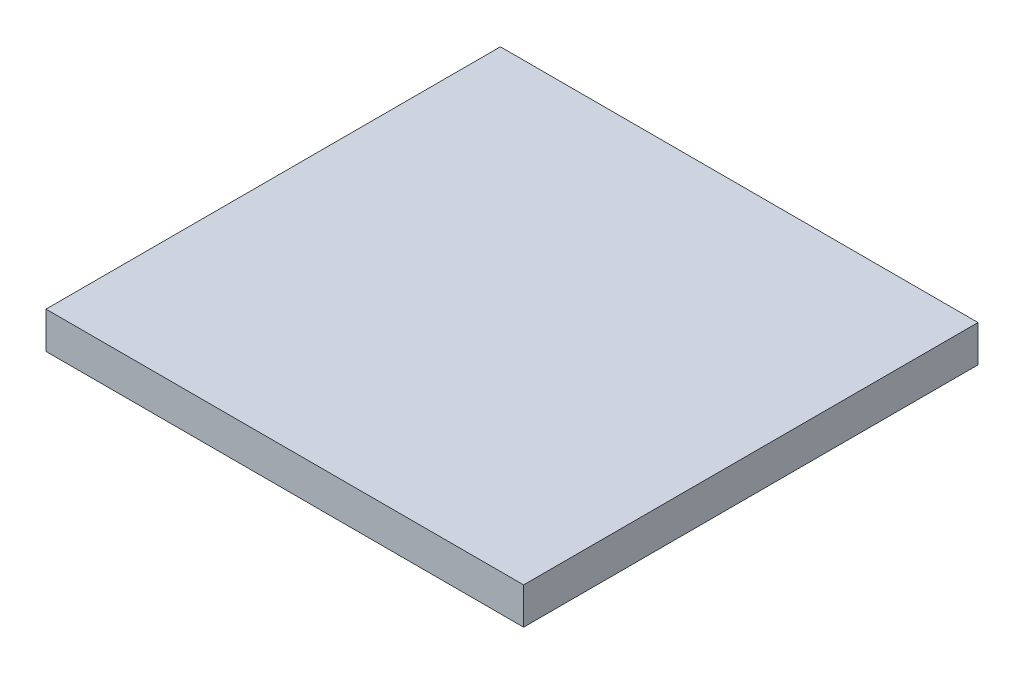
ISO-10303-21;
HEADER;
FILE_DESCRIPTION(('STEP AP214'),'2;1');
FILE_NAME('part.step','',(''),(''),'','','');
FILE_SCHEMA(('AUTOMOTIVE_DESIGN { 1 0 10303 214 1 1 1 1 }'));
ENDSEC;
DATA;
#1=APPLICATION_CONTEXT('core data for automotive mechanical design processes');
#2=APPLICATION_PROTOCOL_DEFINITION('international standard','automotive_design',2000,#1);
#3=PRODUCT_CONTEXT('',#1,'mechanical');
#4=PRODUCT('Part','Part','',(#3));
#5=PRODUCT_RELATED_PRODUCT_CATEGORY('part','',(#4));
#6=PRODUCT_DEFINITION_FORMATION('','',#4);
#7=PRODUCT_DEFINITION_CONTEXT('part definition',#1,'design');
#8=PRODUCT_DEFINITION('design','',#6,#7);
#9=PRODUCT_DEFINITION_SHAPE('','',#8);
#10=(LENGTH_UNIT() NAMED_UNIT(*) SI_UNIT(.MILLI.,.METRE.));
#11=(NAMED_UNIT(*) PLANE_ANGLE_UNIT() SI_UNIT($,.RADIAN.));
#12=(NAMED_UNIT(*) SI_UNIT($,.STERADIAN.) SOLID_ANGLE_UNIT());
#13=UNCERTAINTY_MEASURE_WITH_UNIT(LENGTH_MEASURE(1.E-05),#10,'distance_accuracy_value','');
#14=(GEOMETRIC_REPRESENTATION_CONTEXT(3) GLOBAL_UNCERTAINTY_ASSIGNED_CONTEXT((#13)) GLOBAL_UNIT_ASSIGNED_CONTEXT((#10,
#11,#12)) REPRESENTATION_CONTEXT('',''));
#15=CARTESIAN_POINT('',(0.,0.,0.));
#16=DIRECTION('',(0.,0.,1.));
#17=DIRECTION('',(1.,0.,0.));
#18=AXIS2_PLACEMENT_3D('',#15,#16,#17);
#19=CARTESIAN_POINT('',(19.535,3.,-18.585));
#20=DIRECTION('',(-1.,0.,0.));
#21=DIRECTION('',(0.,0.,1.));
#22=AXIS2_PLACEMENT_3D('',#19,#20,#21);
#23=PLANE('',#22);
#24=DIRECTION('',(0.,0.,-1.));
#25=VECTOR('',#24,1.);
#26=CARTESIAN_POINT('',(19.535,0.,-18.585));
#27=LINE('',#26,#25);
#28=CARTESIAN_POINT('',(19.535,0.,18.585));
#29=VERTEX_POINT('',#28);
#30=CARTESIAN_POINT('',(19.535,0.,-18.585));
#31=VERTEX_POINT('',#30);
#32=EDGE_CURVE('E111',#29,#31,#27,.T.);
#33=ORIENTED_EDGE('',*,*,#32,.T.);
#34=DIRECTION('',(0.,-1.,0.));
#35=VECTOR('',#34,1.);
#36=CARTESIAN_POINT('',(19.535,3.,-18.585));
#37=LINE('',#36,#35);
#38=CARTESIAN_POINT('',(19.535,3.,-18.585));
#39=VERTEX_POINT('',#38);
#40=EDGE_CURVE('E11',#39,#31,#37,.T.);
#41=ORIENTED_EDGE('',*,*,#40,.F.);
#42=DIRECTION('',(0.,0.,-1.));
#43=VECTOR('',#42,1.);
#44=CARTESIAN_POINT('',(19.535,3.,-18.585));
#45=LINE('',#44,#43);
#46=CARTESIAN_POINT('',(19.535,3.,18.585));
#47=VERTEX_POINT('',#46);
#48=EDGE_CURVE('E95',#47,#39,#45,.T.);
#49=ORIENTED_EDGE('',*,*,#48,.F.);
#50=DIRECTION('',(0.,-1.,0.));
#51=VECTOR('',#50,1.);
#52=CARTESIAN_POINT('',(19.535,3.,18.585));
#53=LINE('',#52,#51);
#54=EDGE_CURVE('E107',#47,#29,#53,.T.);
#55=ORIENTED_EDGE('',*,*,#54,.T.);
#56=EDGE_LOOP('',(#33,#41,#49,#55));
#57=FACE_BOUND('',#56,.T.);
#58=ADVANCED_FACE('F43',(#57),#23,.F.);
#59=CARTESIAN_POINT('',(-19.535,3.,-18.585));
#60=DIRECTION('',(0.,0.,1.));
#61=DIRECTION('',(1.,0.,0.));
#62=AXIS2_PLACEMENT_3D('',#59,#60,#61);
#63=PLANE('',#62);
#64=DIRECTION('',(-1.,0.,0.));
#65=VECTOR('',#64,1.);
#66=CARTESIAN_POINT('',(-19.535,0.,-18.585));
#67=LINE('',#66,#65);
#68=CARTESIAN_POINT('',(-19.535,0.,-18.585));
#69=VERTEX_POINT('',#68);
#70=EDGE_CURVE('E100',#31,#69,#67,.T.);
#71=ORIENTED_EDGE('',*,*,#70,.T.);
#72=DIRECTION('',(0.,-1.,0.));
#73=VECTOR('',#72,1.);
#74=CARTESIAN_POINT('',(-19.535,3.,-18.585));
#75=LINE('',#74,#73);
#76=CARTESIAN_POINT('',(-19.535,3.,-18.585));
#77=VERTEX_POINT('',#76);
#78=EDGE_CURVE('E52',#77,#69,#75,.T.);
#79=ORIENTED_EDGE('',*,*,#78,.F.);
#80=DIRECTION('',(-1.,0.,0.));
#81=VECTOR('',#80,1.);
#82=CARTESIAN_POINT('',(-19.535,3.,-18.585));
#83=LINE('',#82,#81);
#84=EDGE_CURVE('E90',#39,#77,#83,.T.);
#85=ORIENTED_EDGE('',*,*,#84,.F.);
#86=ORIENTED_EDGE('',*,*,#40,.T.);
#87=EDGE_LOOP('',(#71,#79,#85,#86));
#88=FACE_BOUND('',#87,.T.);
#89=ADVANCED_FACE('F99',(#88),#63,.F.);
#90=CARTESIAN_POINT('',(-19.535,3.,-18.585));
#91=DIRECTION('',(1.,0.,0.));
#92=DIRECTION('',(0.,0.,-1.));
#93=AXIS2_PLACEMENT_3D('',#90,#91,#92);
#94=PLANE('',#93);
#95=DIRECTION('',(0.,0.,1.));
#96=VECTOR('',#95,1.);
#97=CARTESIAN_POINT('',(-19.535,0.,-18.585));
#98=LINE('',#97,#96);
#99=CARTESIAN_POINT('',(-19.535,0.,18.585));
#100=VERTEX_POINT('',#99);
#101=EDGE_CURVE('E77',#69,#100,#98,.T.);
#102=ORIENTED_EDGE('',*,*,#101,.T.);
#103=DIRECTION('',(0.,-1.,0.));
#104=VECTOR('',#103,1.);
#105=CARTESIAN_POINT('',(-19.535,3.,18.585));
#106=LINE('',#105,#104);
#107=CARTESIAN_POINT('',(-19.535,3.,18.585));
#108=VERTEX_POINT('',#107);
#109=EDGE_CURVE('E102',#108,#100,#106,.T.);
#110=ORIENTED_EDGE('',*,*,#109,.F.);
#111=DIRECTION('',(0.,0.,1.));
#112=VECTOR('',#111,1.);
#113=CARTESIAN_POINT('',(-19.535,3.,-18.585));
#114=LINE('',#113,#112);
#115=EDGE_CURVE('E93',#77,#108,#114,.T.);
#116=ORIENTED_EDGE('',*,*,#115,.F.);
#117=ORIENTED_EDGE('',*,*,#78,.T.);
#118=EDGE_LOOP('',(#102,#110,#116,#117));
#119=FACE_BOUND('',#118,.T.);
#120=ADVANCED_FACE('F103',(#119),#94,.F.);
#121=CARTESIAN_POINT('',(-19.535,3.,18.585));
#122=DIRECTION('',(0.,0.,-1.));
#123=DIRECTION('',(-1.,0.,0.));
#124=AXIS2_PLACEMENT_3D('',#121,#122,#123);
#125=PLANE('',#124);
#126=DIRECTION('',(1.,0.,0.));
#127=VECTOR('',#126,1.);
#128=CARTESIAN_POINT('',(-19.535,0.,18.585));
#129=LINE('',#128,#127);
#130=EDGE_CURVE('E83',#100,#29,#129,.T.);
#131=ORIENTED_EDGE('',*,*,#130,.T.);
#132=ORIENTED_EDGE('',*,*,#54,.F.);
#133=DIRECTION('',(1.,0.,0.));
#134=VECTOR('',#133,1.);
#135=CARTESIAN_POINT('',(-19.535,3.,18.585));
#136=LINE('',#135,#134);
#137=EDGE_CURVE('E60',#108,#47,#136,.T.);
#138=ORIENTED_EDGE('',*,*,#137,.F.);
#139=ORIENTED_EDGE('',*,*,#109,.T.);
#140=EDGE_LOOP('',(#131,#132,#138,#139));
#141=FACE_BOUND('',#140,.T.);
#142=ADVANCED_FACE('F124',(#141),#125,.F.);
#143=CARTESIAN_POINT('',(0.,3.,0.));
#144=DIRECTION('',(0.,1.,0.));
#145=DIRECTION('',(0.,0.,1.));
#146=AXIS2_PLACEMENT_3D('',#143,#144,#145);
#147=PLANE('',#146);
#148=ORIENTED_EDGE('',*,*,#48,.T.);
#149=ORIENTED_EDGE('',*,*,#84,.T.);
#150=ORIENTED_EDGE('',*,*,#115,.T.);
#151=ORIENTED_EDGE('',*,*,#137,.T.);
#152=EDGE_LOOP('',(#148,#149,#150,#151));
#153=FACE_BOUND('',#152,.T.);
#154=ADVANCED_FACE('F91',(#153),#147,.T.);
#155=CARTESIAN_POINT('',(0.,0.,0.));
#156=DIRECTION('',(0.,1.,0.));
#157=DIRECTION('',(0.,0.,1.));
#158=AXIS2_PLACEMENT_3D('',#155,#156,#157);
#159=PLANE('',#158);
#160=ORIENTED_EDGE('',*,*,#32,.F.);
#161=ORIENTED_EDGE('',*,*,#130,.F.);
#162=ORIENTED_EDGE('',*,*,#101,.F.);
#163=ORIENTED_EDGE('',*,*,#70,.F.);
#164=EDGE_LOOP('',(#160,#161,#162,#163));
#165=FACE_BOUND('',#164,.T.);
#166=ADVANCED_FACE('F127',(#165),#159,.F.);
#167=CLOSED_SHELL('',(#58,#89,#120,#142,#154,#166));
#168=MANIFOLD_SOLID_BREP('B2',#167);
#169=ADVANCED_BREP_SHAPE_REPRESENTATION('',(#18,#168),#14);
#170=SHAPE_DEFINITION_REPRESENTATION(#9,#169);
ENDSEC;
END-ISO-10303-21;
